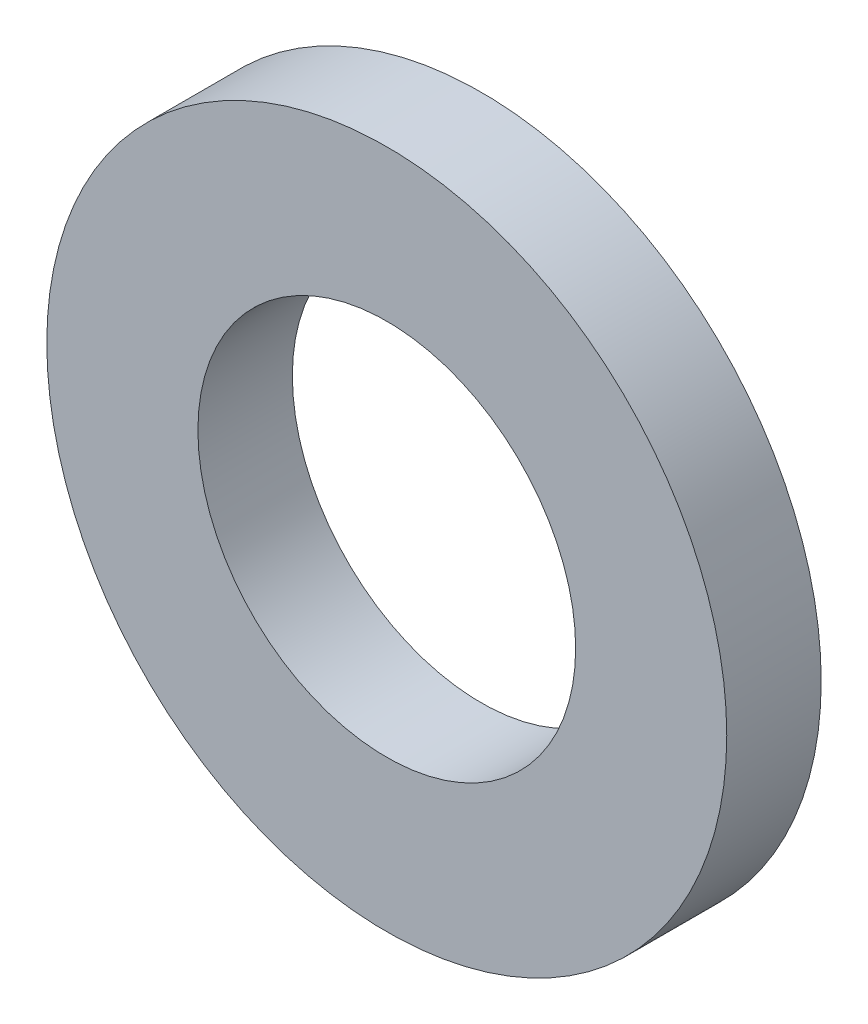
ISO-10303-21;
HEADER;
FILE_DESCRIPTION(('STEP AP214'),'2;1');
FILE_NAME('part.step','',(''),(''),'','','');
FILE_SCHEMA(('AUTOMOTIVE_DESIGN { 1 0 10303 214 1 1 1 1 }'));
ENDSEC;
DATA;
#1=APPLICATION_CONTEXT('core data for automotive mechanical design processes');
#2=APPLICATION_PROTOCOL_DEFINITION('international standard','automotive_design',2000,#1);
#3=PRODUCT_CONTEXT('',#1,'mechanical');
#4=PRODUCT('Part','Part','',(#3));
#5=PRODUCT_RELATED_PRODUCT_CATEGORY('part','',(#4));
#6=PRODUCT_DEFINITION_FORMATION('','',#4);
#7=PRODUCT_DEFINITION_CONTEXT('part definition',#1,'design');
#8=PRODUCT_DEFINITION('design','',#6,#7);
#9=PRODUCT_DEFINITION_SHAPE('','',#8);
#10=(LENGTH_UNIT() NAMED_UNIT(*) SI_UNIT(.MILLI.,.METRE.));
#11=(NAMED_UNIT(*) PLANE_ANGLE_UNIT() SI_UNIT($,.RADIAN.));
#12=(NAMED_UNIT(*) SI_UNIT($,.STERADIAN.) SOLID_ANGLE_UNIT());
#13=UNCERTAINTY_MEASURE_WITH_UNIT(LENGTH_MEASURE(1.E-05),#10,'distance_accuracy_value','');
#14=(GEOMETRIC_REPRESENTATION_CONTEXT(3) GLOBAL_UNCERTAINTY_ASSIGNED_CONTEXT((#13)) GLOBAL_UNIT_ASSIGNED_CONTEXT((#10,
#11,#12)) REPRESENTATION_CONTEXT('',''));
#15=CARTESIAN_POINT('',(0.,0.,0.));
#16=DIRECTION('',(0.,0.,1.));
#17=DIRECTION('',(1.,0.,0.));
#18=AXIS2_PLACEMENT_3D('',#15,#16,#17);
#19=CARTESIAN_POINT('',(0.,0.,1.24999999999997));
#20=DIRECTION('',(0.,0.,-1.));
#21=DIRECTION('',(1.,0.,0.));
#22=AXIS2_PLACEMENT_3D('',#19,#20,#21);
#23=CYLINDRICAL_SURFACE('',#22,9.);
#24=CARTESIAN_POINT('',(0.,0.,2.49999999999995));
#25=DIRECTION('',(0.,0.,1.));
#26=DIRECTION('',(1.,0.,0.));
#27=AXIS2_PLACEMENT_3D('',#24,#25,#26);
#28=CIRCLE('',#27,9.);
#29=CARTESIAN_POINT('',(9.00000000000001,0.,2.49999999999995));
#30=VERTEX_POINT('',#29);
#31=EDGE_CURVE('E27',#30,#30,#28,.T.);
#32=ORIENTED_EDGE('',*,*,#31,.F.);
#33=EDGE_LOOP('',(#32));
#34=FACE_BOUND('',#33,.T.);
#35=CARTESIAN_POINT('',(0.,0.,0.));
#36=DIRECTION('',(0.,0.,1.));
#37=DIRECTION('',(1.,0.,0.));
#38=AXIS2_PLACEMENT_3D('',#35,#36,#37);
#39=CIRCLE('',#38,9.);
#40=CARTESIAN_POINT('',(9.00000000000001,0.,0.));
#41=VERTEX_POINT('',#40);
#42=EDGE_CURVE('E11',#41,#41,#39,.T.);
#43=ORIENTED_EDGE('',*,*,#42,.T.);
#44=EDGE_LOOP('',(#43));
#45=FACE_BOUND('',#44,.T.);
#46=ADVANCED_FACE('F16',(#34,#45),#23,.T.);
#47=CARTESIAN_POINT('',(7.00000000000001,0.,2.49999999999995));
#48=DIRECTION('',(0.,0.,1.));
#49=DIRECTION('',(1.,0.,0.));
#50=AXIS2_PLACEMENT_3D('',#47,#48,#49);
#51=PLANE('',#50);
#52=CARTESIAN_POINT('',(0.,0.,2.49999999999995));
#53=DIRECTION('',(0.,0.,1.));
#54=DIRECTION('',(1.,0.,0.));
#55=AXIS2_PLACEMENT_3D('',#52,#53,#54);
#56=CIRCLE('',#55,5.);
#57=CARTESIAN_POINT('',(5.,0.,2.49999999999995));
#58=VERTEX_POINT('',#57);
#59=EDGE_CURVE('E42',#58,#58,#56,.T.);
#60=ORIENTED_EDGE('',*,*,#59,.F.);
#61=EDGE_LOOP('',(#60));
#62=FACE_BOUND('',#61,.T.);
#63=ORIENTED_EDGE('',*,*,#31,.T.);
#64=EDGE_LOOP('',(#63));
#65=FACE_BOUND('',#64,.T.);
#66=ADVANCED_FACE('F18',(#62,#65),#51,.T.);
#67=CARTESIAN_POINT('',(0.,0.,1.24999999999997));
#68=DIRECTION('',(0.,0.,-1.));
#69=DIRECTION('',(1.,0.,0.));
#70=AXIS2_PLACEMENT_3D('',#67,#68,#69);
#71=CYLINDRICAL_SURFACE('',#70,5.);
#72=CARTESIAN_POINT('',(0.,0.,0.));
#73=DIRECTION('',(0.,0.,1.));
#74=DIRECTION('',(1.,0.,0.));
#75=AXIS2_PLACEMENT_3D('',#72,#73,#74);
#76=CIRCLE('',#75,5.);
#77=CARTESIAN_POINT('',(5.,0.,0.));
#78=VERTEX_POINT('',#77);
#79=EDGE_CURVE('E20',#78,#78,#76,.T.);
#80=ORIENTED_EDGE('',*,*,#79,.F.);
#81=EDGE_LOOP('',(#80));
#82=FACE_BOUND('',#81,.T.);
#83=ORIENTED_EDGE('',*,*,#59,.T.);
#84=EDGE_LOOP('',(#83));
#85=FACE_BOUND('',#84,.T.);
#86=ADVANCED_FACE('F56',(#82,#85),#71,.F.);
#87=CARTESIAN_POINT('',(7.00000000000001,0.,0.));
#88=DIRECTION('',(0.,0.,-1.));
#89=DIRECTION('',(-1.,0.,0.));
#90=AXIS2_PLACEMENT_3D('',#87,#88,#89);
#91=PLANE('',#90);
#92=ORIENTED_EDGE('',*,*,#42,.F.);
#93=EDGE_LOOP('',(#92));
#94=FACE_BOUND('',#93,.T.);
#95=ORIENTED_EDGE('',*,*,#79,.T.);
#96=EDGE_LOOP('',(#95));
#97=FACE_BOUND('',#96,.T.);
#98=ADVANCED_FACE('F54',(#94,#97),#91,.T.);
#99=CLOSED_SHELL('',(#46,#66,#86,#98));
#100=MANIFOLD_SOLID_BREP('B1',#99);
#101=ADVANCED_BREP_SHAPE_REPRESENTATION('',(#18,#100),#14);
#102=SHAPE_DEFINITION_REPRESENTATION(#9,#101);
ENDSEC;
END-ISO-10303-21;
